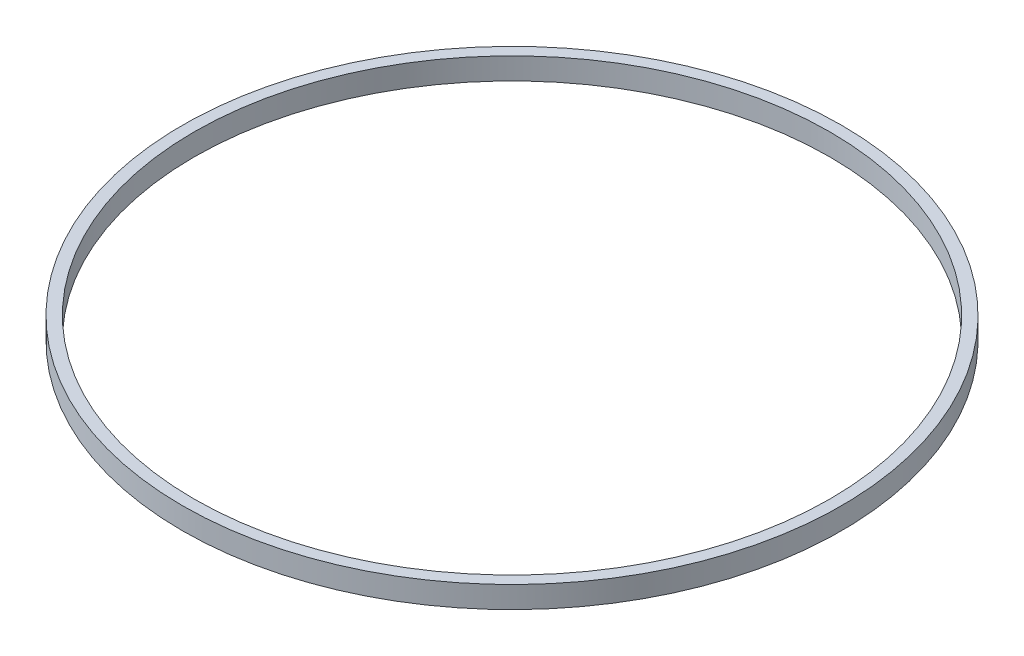
ISO-10303-21;
HEADER;
FILE_DESCRIPTION(('STEP AP214'),'2;1');
FILE_NAME('part.step','',(''),(''),'','','');
FILE_SCHEMA(('AUTOMOTIVE_DESIGN { 1 0 10303 214 1 1 1 1 }'));
ENDSEC;
DATA;
#1=APPLICATION_CONTEXT('core data for automotive mechanical design processes');
#2=APPLICATION_PROTOCOL_DEFINITION('international standard','automotive_design',2000,#1);
#3=PRODUCT_CONTEXT('',#1,'mechanical');
#4=PRODUCT('Part','Part','',(#3));
#5=PRODUCT_RELATED_PRODUCT_CATEGORY('part','',(#4));
#6=PRODUCT_DEFINITION_FORMATION('','',#4);
#7=PRODUCT_DEFINITION_CONTEXT('part definition',#1,'design');
#8=PRODUCT_DEFINITION('design','',#6,#7);
#9=PRODUCT_DEFINITION_SHAPE('','',#8);
#10=(LENGTH_UNIT() NAMED_UNIT(*) SI_UNIT(.MILLI.,.METRE.));
#11=(NAMED_UNIT(*) PLANE_ANGLE_UNIT() SI_UNIT($,.RADIAN.));
#12=(NAMED_UNIT(*) SI_UNIT($,.STERADIAN.) SOLID_ANGLE_UNIT());
#13=UNCERTAINTY_MEASURE_WITH_UNIT(LENGTH_MEASURE(1.E-05),#10,'distance_accuracy_value','');
#14=(GEOMETRIC_REPRESENTATION_CONTEXT(3) GLOBAL_UNCERTAINTY_ASSIGNED_CONTEXT((#13)) GLOBAL_UNIT_ASSIGNED_CONTEXT((#10,
#11,#12)) REPRESENTATION_CONTEXT('',''));
#15=CARTESIAN_POINT('',(0.,0.,0.));
#16=DIRECTION('',(0.,0.,1.));
#17=DIRECTION('',(1.,0.,0.));
#18=AXIS2_PLACEMENT_3D('',#15,#16,#17);
#19=CARTESIAN_POINT('',(0.,2.9972,0.));
#20=DIRECTION('',(0.,1.,0.));
#21=DIRECTION('',(0.,0.,1.));
#22=AXIS2_PLACEMENT_3D('',#19,#20,#21);
#23=PLANE('',#22);
#24=CARTESIAN_POINT('',(0.,2.9972,0.));
#25=DIRECTION('',(0.,1.,0.));
#26=DIRECTION('',(1.,0.,0.));
#27=AXIS2_PLACEMENT_3D('',#24,#25,#26);
#28=CIRCLE('',#27,45.4152);
#29=CARTESIAN_POINT('',(0.,2.9972,-45.4152));
#30=VERTEX_POINT('',#29);
#31=EDGE_CURVE('E11',#30,#30,#28,.T.);
#32=ORIENTED_EDGE('',*,*,#31,.T.);
#33=EDGE_LOOP('',(#32));
#34=FACE_BOUND('',#33,.T.);
#35=CARTESIAN_POINT('',(0.,2.9972,0.));
#36=DIRECTION('',(0.,1.,0.));
#37=DIRECTION('',(0.,0.,1.));
#38=AXIS2_PLACEMENT_3D('',#35,#36,#37);
#39=CIRCLE('',#38,43.815);
#40=CARTESIAN_POINT('',(0.,2.9972,-43.815));
#41=VERTEX_POINT('',#40);
#42=EDGE_CURVE('E55',#41,#41,#39,.T.);
#43=ORIENTED_EDGE('',*,*,#42,.F.);
#44=EDGE_LOOP('',(#43));
#45=FACE_BOUND('',#44,.T.);
#46=ADVANCED_FACE('F44',(#34,#45),#23,.T.);
#47=CARTESIAN_POINT('',(0.,0.,0.));
#48=DIRECTION('',(0.,1.,0.));
#49=DIRECTION('',(0.,0.,1.));
#50=AXIS2_PLACEMENT_3D('',#47,#48,#49);
#51=PLANE('',#50);
#52=CARTESIAN_POINT('',(0.,0.,0.));
#53=DIRECTION('',(0.,1.,0.));
#54=DIRECTION('',(1.,0.,0.));
#55=AXIS2_PLACEMENT_3D('',#52,#53,#54);
#56=CIRCLE('',#55,45.4152);
#57=CARTESIAN_POINT('',(0.,0.,-45.4152));
#58=VERTEX_POINT('',#57);
#59=EDGE_CURVE('E48',#58,#58,#56,.T.);
#60=ORIENTED_EDGE('',*,*,#59,.F.);
#61=EDGE_LOOP('',(#60));
#62=FACE_BOUND('',#61,.T.);
#63=CARTESIAN_POINT('',(0.,0.,0.));
#64=DIRECTION('',(0.,1.,0.));
#65=DIRECTION('',(0.,0.,1.));
#66=AXIS2_PLACEMENT_3D('',#63,#64,#65);
#67=CIRCLE('',#66,43.815);
#68=CARTESIAN_POINT('',(0.,0.,-43.815));
#69=VERTEX_POINT('',#68);
#70=EDGE_CURVE('E57',#69,#69,#67,.T.);
#71=ORIENTED_EDGE('',*,*,#70,.T.);
#72=EDGE_LOOP('',(#71));
#73=FACE_BOUND('',#72,.T.);
#74=ADVANCED_FACE('F67',(#62,#73),#51,.F.);
#75=CARTESIAN_POINT('',(0.,2.9972,0.));
#76=DIRECTION('',(0.,-1.,0.));
#77=DIRECTION('',(0.,0.,-1.));
#78=AXIS2_PLACEMENT_3D('',#75,#76,#77);
#79=CYLINDRICAL_SURFACE('',#78,45.4152);
#80=CARTESIAN_POINT('',(0.,2.9972,-45.4152));
#81=CARTESIAN_POINT('',(0.,2.96597916666667,-45.4152));
#82=CARTESIAN_POINT('',(0.,2.93475833333333,-45.4152));
#83=CARTESIAN_POINT('',(0.,2.87231666666667,-45.4152));
#84=CARTESIAN_POINT('',(0.,2.84109583333333,-45.4152));
#85=CARTESIAN_POINT('',(0.,2.77865416666667,-45.4152));
#86=CARTESIAN_POINT('',(0.,2.74743333333333,-45.4152));
#87=CARTESIAN_POINT('',(0.,2.68499166666667,-45.4152));
#88=CARTESIAN_POINT('',(0.,2.65377083333333,-45.4152));
#89=CARTESIAN_POINT('',(0.,2.59132916666667,-45.4152));
#90=CARTESIAN_POINT('',(0.,2.56010833333333,-45.4152));
#91=CARTESIAN_POINT('',(0.,2.49766666666667,-45.4152));
#92=CARTESIAN_POINT('',(0.,2.46644583333333,-45.4152));
#93=CARTESIAN_POINT('',(0.,2.40400416666667,-45.4152));
#94=CARTESIAN_POINT('',(0.,2.37278333333333,-45.4152));
#95=CARTESIAN_POINT('',(0.,2.31034166666667,-45.4152));
#96=CARTESIAN_POINT('',(0.,2.27912083333333,-45.4152));
#97=CARTESIAN_POINT('',(0.,2.21667916666667,-45.4152));
#98=CARTESIAN_POINT('',(0.,2.18545833333333,-45.4152));
#99=CARTESIAN_POINT('',(0.,2.12301666666667,-45.4152));
#100=CARTESIAN_POINT('',(0.,2.09179583333333,-45.4152));
#101=CARTESIAN_POINT('',(0.,2.02935416666667,-45.4152));
#102=CARTESIAN_POINT('',(0.,1.99813333333333,-45.4152));
#103=CARTESIAN_POINT('',(0.,1.93569166666667,-45.4152));
#104=CARTESIAN_POINT('',(0.,1.90447083333333,-45.4152));
#105=CARTESIAN_POINT('',(0.,1.84202916666667,-45.4152));
#106=CARTESIAN_POINT('',(0.,1.81080833333333,-45.4152));
#107=CARTESIAN_POINT('',(0.,1.74836666666667,-45.4152));
#108=CARTESIAN_POINT('',(0.,1.71714583333333,-45.4152));
#109=CARTESIAN_POINT('',(0.,1.65470416666667,-45.4152));
#110=CARTESIAN_POINT('',(0.,1.62348333333333,-45.4152));
#111=CARTESIAN_POINT('',(0.,1.56104166666667,-45.4152));
#112=CARTESIAN_POINT('',(0.,1.52982083333333,-45.4152));
#113=CARTESIAN_POINT('',(0.,1.46737916666667,-45.4152));
#114=CARTESIAN_POINT('',(0.,1.43615833333333,-45.4152));
#115=CARTESIAN_POINT('',(0.,1.37371666666667,-45.4152));
#116=CARTESIAN_POINT('',(0.,1.34249583333333,-45.4152));
#117=CARTESIAN_POINT('',(0.,1.28005416666667,-45.4152));
#118=CARTESIAN_POINT('',(0.,1.24883333333333,-45.4152));
#119=CARTESIAN_POINT('',(0.,1.18639166666667,-45.4152));
#120=CARTESIAN_POINT('',(0.,1.15517083333333,-45.4152));
#121=CARTESIAN_POINT('',(0.,1.09272916666667,-45.4152));
#122=CARTESIAN_POINT('',(0.,1.06150833333333,-45.4152));
#123=CARTESIAN_POINT('',(0.,0.999066666666667,-45.4152));
#124=CARTESIAN_POINT('',(0.,0.967845833333333,-45.4152));
#125=CARTESIAN_POINT('',(0.,0.905404166666667,-45.4152));
#126=CARTESIAN_POINT('',(0.,0.874183333333333,-45.4152));
#127=CARTESIAN_POINT('',(0.,0.811741666666667,-45.4152));
#128=CARTESIAN_POINT('',(0.,0.780520833333333,-45.4152));
#129=CARTESIAN_POINT('',(0.,0.718079166666667,-45.4152));
#130=CARTESIAN_POINT('',(0.,0.686858333333333,-45.4152));
#131=CARTESIAN_POINT('',(0.,0.624416666666667,-45.4152));
#132=CARTESIAN_POINT('',(0.,0.593195833333333,-45.4152));
#133=CARTESIAN_POINT('',(0.,0.530754166666667,-45.4152));
#134=CARTESIAN_POINT('',(0.,0.499533333333333,-45.4152));
#135=CARTESIAN_POINT('',(0.,0.437091666666667,-45.4152));
#136=CARTESIAN_POINT('',(0.,0.405870833333333,-45.4152));
#137=CARTESIAN_POINT('',(0.,0.343429166666667,-45.4152));
#138=CARTESIAN_POINT('',(0.,0.312208333333333,-45.4152));
#139=CARTESIAN_POINT('',(0.,0.249766666666667,-45.4152));
#140=CARTESIAN_POINT('',(0.,0.218545833333333,-45.4152));
#141=CARTESIAN_POINT('',(0.,0.156104166666667,-45.4152));
#142=CARTESIAN_POINT('',(0.,0.124883333333333,-45.4152));
#143=CARTESIAN_POINT('',(0.,0.0624416666666668,-45.4152));
#144=CARTESIAN_POINT('',(0.,0.0312208333333333,-45.4152));
#145=CARTESIAN_POINT('',(0.,0.,-45.4152));
#146=B_SPLINE_CURVE_WITH_KNOTS('',3,(#80,#81,#82,#83,#84,#85,#86,#87,#88,#89,#90,#91,#92,#93,
#94,#95,#96,#97,#98,#99,#100,#101,#102,#103,#104,#105,#106,#107,#108,#109,#110,#111,#112,#113,
#114,#115,#116,#117,#118,#119,#120,#121,#122,#123,#124,#125,#126,#127,#128,#129,#130,#131,#132,
#133,#134,#135,#136,#137,#138,#139,#140,#141,#142,#143,#144,#145),.UNSPECIFIED.,.F.,.F.,(4,2,2,
2,2,2,2,2,2,2,2,2,2,2,2,2,2,2,2,2,2,2,2,2,2,2,2,2,2,2,2,2,4),(0.,0.0936625000000002,0.187325,
0.2809875,0.37465,0.4683125,0.561975,0.6556375,0.7493,0.8429625,0.936625,1.0302875,1.12395,
1.2176125,1.311275,1.4049375,1.4986,1.5922625,1.685925,1.7795875,1.87325,1.9669125,2.060575,
2.1542375,2.2479,2.3415625,2.435225,2.5288875,2.62255,2.7162125,2.809875,2.9035375,2.9972),.UNSPECIFIED.);
#147=EDGE_CURVE('BSEAM46',#30,#58,#146,.T.);
#148=ORIENTED_EDGE('',*,*,#31,.F.);
#149=ORIENTED_EDGE('',*,*,#59,.T.);
#150=ORIENTED_EDGE('',*,*,#147,.T.);
#151=ORIENTED_EDGE('',*,*,#147,.F.);
#152=EDGE_LOOP('',(#148,#150,#149,#151));
#153=FACE_BOUND('',#152,.T.);
#154=ADVANCED_FACE('F46',(#153),#79,.T.);
#155=CARTESIAN_POINT('',(0.,2.9972,0.));
#156=DIRECTION('',(0.,-1.,0.));
#157=DIRECTION('',(0.,0.,-1.));
#158=AXIS2_PLACEMENT_3D('',#155,#156,#157);
#159=CYLINDRICAL_SURFACE('',#158,43.815);
#160=CARTESIAN_POINT('',(0.,2.9972,-43.815));
#161=CARTESIAN_POINT('',(0.,2.96597916666667,-43.815));
#162=CARTESIAN_POINT('',(0.,2.93475833333333,-43.815));
#163=CARTESIAN_POINT('',(0.,2.87231666666667,-43.815));
#164=CARTESIAN_POINT('',(0.,2.84109583333333,-43.815));
#165=CARTESIAN_POINT('',(0.,2.77865416666667,-43.815));
#166=CARTESIAN_POINT('',(0.,2.74743333333333,-43.815));
#167=CARTESIAN_POINT('',(0.,2.68499166666667,-43.815));
#168=CARTESIAN_POINT('',(0.,2.65377083333333,-43.815));
#169=CARTESIAN_POINT('',(0.,2.59132916666667,-43.815));
#170=CARTESIAN_POINT('',(0.,2.56010833333333,-43.815));
#171=CARTESIAN_POINT('',(0.,2.49766666666667,-43.815));
#172=CARTESIAN_POINT('',(0.,2.46644583333333,-43.815));
#173=CARTESIAN_POINT('',(0.,2.40400416666667,-43.815));
#174=CARTESIAN_POINT('',(0.,2.37278333333333,-43.815));
#175=CARTESIAN_POINT('',(0.,2.31034166666667,-43.815));
#176=CARTESIAN_POINT('',(0.,2.27912083333333,-43.815));
#177=CARTESIAN_POINT('',(0.,2.21667916666667,-43.815));
#178=CARTESIAN_POINT('',(0.,2.18545833333333,-43.815));
#179=CARTESIAN_POINT('',(0.,2.12301666666667,-43.815));
#180=CARTESIAN_POINT('',(0.,2.09179583333333,-43.815));
#181=CARTESIAN_POINT('',(0.,2.02935416666667,-43.815));
#182=CARTESIAN_POINT('',(0.,1.99813333333333,-43.815));
#183=CARTESIAN_POINT('',(0.,1.93569166666667,-43.815));
#184=CARTESIAN_POINT('',(0.,1.90447083333333,-43.815));
#185=CARTESIAN_POINT('',(0.,1.84202916666667,-43.815));
#186=CARTESIAN_POINT('',(0.,1.81080833333333,-43.815));
#187=CARTESIAN_POINT('',(0.,1.74836666666667,-43.815));
#188=CARTESIAN_POINT('',(0.,1.71714583333333,-43.815));
#189=CARTESIAN_POINT('',(0.,1.65470416666667,-43.815));
#190=CARTESIAN_POINT('',(0.,1.62348333333333,-43.815));
#191=CARTESIAN_POINT('',(0.,1.56104166666667,-43.815));
#192=CARTESIAN_POINT('',(0.,1.52982083333333,-43.815));
#193=CARTESIAN_POINT('',(0.,1.46737916666667,-43.815));
#194=CARTESIAN_POINT('',(0.,1.43615833333333,-43.815));
#195=CARTESIAN_POINT('',(0.,1.37371666666667,-43.815));
#196=CARTESIAN_POINT('',(0.,1.34249583333333,-43.815));
#197=CARTESIAN_POINT('',(0.,1.28005416666667,-43.815));
#198=CARTESIAN_POINT('',(0.,1.24883333333333,-43.815));
#199=CARTESIAN_POINT('',(0.,1.18639166666667,-43.815));
#200=CARTESIAN_POINT('',(0.,1.15517083333333,-43.815));
#201=CARTESIAN_POINT('',(0.,1.09272916666667,-43.815));
#202=CARTESIAN_POINT('',(0.,1.06150833333333,-43.815));
#203=CARTESIAN_POINT('',(0.,0.999066666666667,-43.815));
#204=CARTESIAN_POINT('',(0.,0.967845833333333,-43.815));
#205=CARTESIAN_POINT('',(0.,0.905404166666667,-43.815));
#206=CARTESIAN_POINT('',(0.,0.874183333333333,-43.815));
#207=CARTESIAN_POINT('',(0.,0.811741666666667,-43.815));
#208=CARTESIAN_POINT('',(0.,0.780520833333333,-43.815));
#209=CARTESIAN_POINT('',(0.,0.718079166666667,-43.815));
#210=CARTESIAN_POINT('',(0.,0.686858333333333,-43.815));
#211=CARTESIAN_POINT('',(0.,0.624416666666667,-43.815));
#212=CARTESIAN_POINT('',(0.,0.593195833333333,-43.815));
#213=CARTESIAN_POINT('',(0.,0.530754166666667,-43.815));
#214=CARTESIAN_POINT('',(0.,0.499533333333333,-43.815));
#215=CARTESIAN_POINT('',(0.,0.437091666666667,-43.815));
#216=CARTESIAN_POINT('',(0.,0.405870833333333,-43.815));
#217=CARTESIAN_POINT('',(0.,0.343429166666667,-43.815));
#218=CARTESIAN_POINT('',(0.,0.312208333333333,-43.815));
#219=CARTESIAN_POINT('',(0.,0.249766666666667,-43.815));
#220=CARTESIAN_POINT('',(0.,0.218545833333333,-43.815));
#221=CARTESIAN_POINT('',(0.,0.156104166666667,-43.815));
#222=CARTESIAN_POINT('',(0.,0.124883333333333,-43.815));
#223=CARTESIAN_POINT('',(0.,0.0624416666666668,-43.815));
#224=CARTESIAN_POINT('',(0.,0.0312208333333333,-43.815));
#225=CARTESIAN_POINT('',(0.,0.,-43.815));
#226=B_SPLINE_CURVE_WITH_KNOTS('',3,(#160,#161,#162,#163,#164,#165,#166,#167,#168,#169,#170,
#171,#172,#173,#174,#175,#176,#177,#178,#179,#180,#181,#182,#183,#184,#185,#186,#187,#188,#189,
#190,#191,#192,#193,#194,#195,#196,#197,#198,#199,#200,#201,#202,#203,#204,#205,#206,#207,#208,
#209,#210,#211,#212,#213,#214,#215,#216,#217,#218,#219,#220,#221,#222,#223,#224,#225),
.UNSPECIFIED.,.F.,.F.,(4,2,2,2,2,2,2,2,2,2,2,2,2,2,2,2,2,2,2,2,2,2,2,2,2,2,2,2,2,2,2,2,4),(0.,
0.0936624999999997,0.187325,0.2809875,0.37465,0.4683125,0.561975,0.655637499999999,0.7493,
0.8429625,0.936624999999999,1.0302875,1.12395,1.2176125,1.311275,1.4049375,1.4986,1.5922625,
1.685925,1.7795875,1.87325,1.9669125,2.060575,2.1542375,2.2479,2.3415625,2.435225,2.5288875,
2.62255,2.7162125,2.809875,2.9035375,2.9972),.UNSPECIFIED.);
#227=EDGE_CURVE('BSEAM63',#41,#69,#226,.T.);
#228=ORIENTED_EDGE('',*,*,#42,.T.);
#229=ORIENTED_EDGE('',*,*,#70,.F.);
#230=ORIENTED_EDGE('',*,*,#227,.T.);
#231=ORIENTED_EDGE('',*,*,#227,.F.);
#232=EDGE_LOOP('',(#228,#230,#229,#231));
#233=FACE_BOUND('',#232,.T.);
#234=ADVANCED_FACE('F63',(#233),#159,.F.);
#235=CLOSED_SHELL('',(#46,#74,#154,#234));
#236=MANIFOLD_SOLID_BREP('B2',#235);
#237=ADVANCED_BREP_SHAPE_REPRESENTATION('',(#18,#236),#14);
#238=SHAPE_DEFINITION_REPRESENTATION(#9,#237);
ENDSEC;
END-ISO-10303-21;
